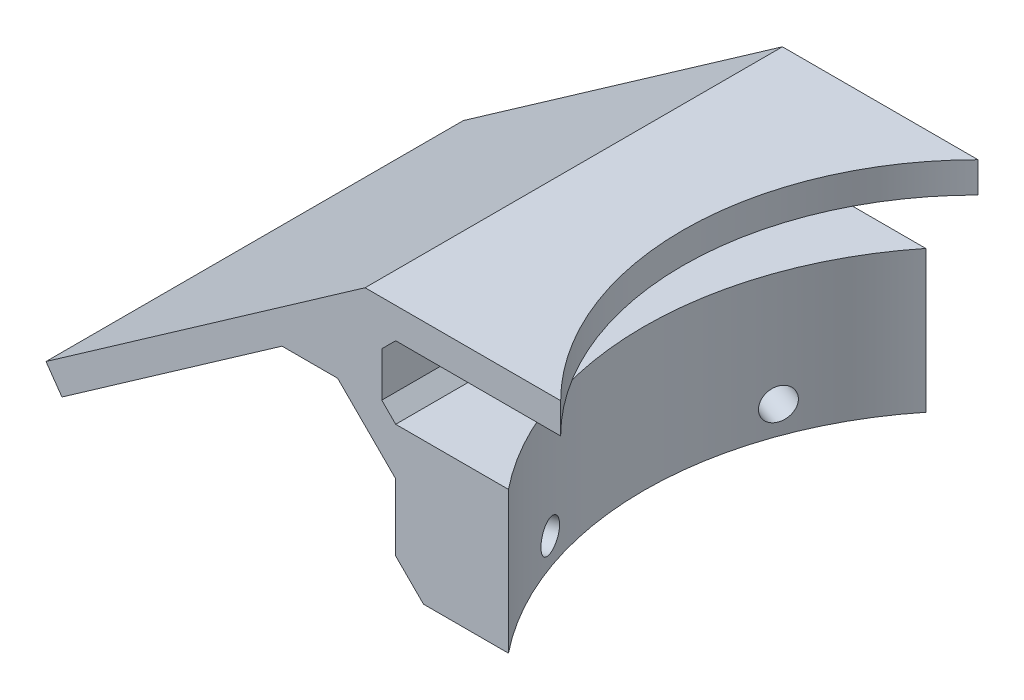
ISO-10303-21;
HEADER;
FILE_DESCRIPTION(('STEP AP214'),'2;1');
FILE_NAME('part.step','',(''),(''),'','','');
FILE_SCHEMA(('AUTOMOTIVE_DESIGN { 1 0 10303 214 1 1 1 1 }'));
ENDSEC;
DATA;
#1=APPLICATION_CONTEXT('core data for automotive mechanical design processes');
#2=APPLICATION_PROTOCOL_DEFINITION('international standard','automotive_design',2000,#1);
#3=PRODUCT_CONTEXT('',#1,'mechanical');
#4=PRODUCT('Part','Part','',(#3));
#5=PRODUCT_RELATED_PRODUCT_CATEGORY('part','',(#4));
#6=PRODUCT_DEFINITION_FORMATION('','',#4);
#7=PRODUCT_DEFINITION_CONTEXT('part definition',#1,'design');
#8=PRODUCT_DEFINITION('design','',#6,#7);
#9=PRODUCT_DEFINITION_SHAPE('','',#8);
#10=(LENGTH_UNIT() NAMED_UNIT(*) SI_UNIT(.MILLI.,.METRE.));
#11=(NAMED_UNIT(*) PLANE_ANGLE_UNIT() SI_UNIT($,.RADIAN.));
#12=(NAMED_UNIT(*) SI_UNIT($,.STERADIAN.) SOLID_ANGLE_UNIT());
#13=UNCERTAINTY_MEASURE_WITH_UNIT(LENGTH_MEASURE(1.E-05),#10,'distance_accuracy_value','');
#14=(GEOMETRIC_REPRESENTATION_CONTEXT(3) GLOBAL_UNCERTAINTY_ASSIGNED_CONTEXT((#13)) GLOBAL_UNIT_ASSIGNED_CONTEXT((#10,
#11,#12)) REPRESENTATION_CONTEXT('',''));
#15=CARTESIAN_POINT('',(0.,0.,0.));
#16=DIRECTION('',(0.,0.,1.));
#17=DIRECTION('',(1.,0.,0.));
#18=AXIS2_PLACEMENT_3D('',#15,#16,#17);
#19=CARTESIAN_POINT('',(0.,25.5,75.));
#20=DIRECTION('',(0.,-1.,0.));
#21=DIRECTION('',(0.,0.,-1.));
#22=AXIS2_PLACEMENT_3D('',#19,#20,#21);
#23=PLANE('',#22);
#24=DIRECTION('',(-1.,0.,0.));
#25=VECTOR('',#24,1.);
#26=CARTESIAN_POINT('',(20.5,25.5,75.));
#27=LINE('',#26,#25);
#28=CARTESIAN_POINT('',(14.262515012012,25.5,75.));
#29=VERTEX_POINT('',#28);
#30=CARTESIAN_POINT('',(-5.99999999999999,25.5,75.));
#31=VERTEX_POINT('',#30);
#32=EDGE_CURVE('E196',#29,#31,#27,.T.);
#33=ORIENTED_EDGE('',*,*,#32,.F.);
#34=CARTESIAN_POINT('',(61.1,25.5,37.5));
#35=DIRECTION('',(0.,-1.,0.));
#36=DIRECTION('',(0.,0.,-1.));
#37=AXIS2_PLACEMENT_3D('',#34,#35,#36);
#38=CIRCLE('',#37,60.);
#39=CARTESIAN_POINT('',(14.262515012012,25.5,0.));
#40=VERTEX_POINT('',#39);
#41=EDGE_CURVE('E197',#29,#40,#38,.T.);
#42=ORIENTED_EDGE('',*,*,#41,.T.);
#43=DIRECTION('',(-1.,0.,0.));
#44=VECTOR('',#43,1.);
#45=CARTESIAN_POINT('',(0.,25.5,0.));
#46=LINE('',#45,#44);
#47=CARTESIAN_POINT('',(-5.99999999999999,25.5,0.));
#48=VERTEX_POINT('',#47);
#49=EDGE_CURVE('E238',#40,#48,#46,.T.);
#50=ORIENTED_EDGE('',*,*,#49,.T.);
#51=DIRECTION('',(0.,0.,-1.));
#52=VECTOR('',#51,1.);
#53=CARTESIAN_POINT('',(-5.99999999999999,25.5,75.));
#54=LINE('',#53,#52);
#55=EDGE_CURVE('E200',#31,#48,#54,.T.);
#56=ORIENTED_EDGE('',*,*,#55,.F.);
#57=EDGE_LOOP('',(#33,#42,#50,#56));
#58=FACE_BOUND('',#57,.T.);
#59=ADVANCED_FACE('F37',(#58),#23,.F.);
#60=CARTESIAN_POINT('',(-5.99999999999999,25.5,75.));
#61=DIRECTION('',(-0.707106781186543,-0.707106781186552,0.));
#62=DIRECTION('',(0.707106781186552,-0.707106781186543,0.));
#63=AXIS2_PLACEMENT_3D('',#60,#61,#62);
#64=PLANE('',#63);
#65=DIRECTION('',(-0.707106781186552,0.707106781186544,0.));
#66=VECTOR('',#65,1.);
#67=CARTESIAN_POINT('',(-5.99999999999999,25.5,0.));
#68=LINE('',#67,#66);
#69=CARTESIAN_POINT('',(-8.50000000000005,28.,0.));
#70=VERTEX_POINT('',#69);
#71=EDGE_CURVE('E240',#48,#70,#68,.T.);
#72=ORIENTED_EDGE('',*,*,#71,.T.);
#73=DIRECTION('',(0.,0.,-1.));
#74=VECTOR('',#73,1.);
#75=CARTESIAN_POINT('',(-8.50000000000005,28.,75.));
#76=LINE('',#75,#74);
#77=CARTESIAN_POINT('',(-8.50000000000005,28.,75.));
#78=VERTEX_POINT('',#77);
#79=EDGE_CURVE('E297',#78,#70,#76,.T.);
#80=ORIENTED_EDGE('',*,*,#79,.F.);
#81=DIRECTION('',(-0.707106781186552,0.707106781186544,0.));
#82=VECTOR('',#81,1.);
#83=CARTESIAN_POINT('',(-5.99999999999999,25.5,75.));
#84=LINE('',#83,#82);
#85=EDGE_CURVE('E204',#31,#78,#84,.T.);
#86=ORIENTED_EDGE('',*,*,#85,.F.);
#87=ORIENTED_EDGE('',*,*,#55,.T.);
#88=EDGE_LOOP('',(#72,#80,#86,#87));
#89=FACE_BOUND('',#88,.T.);
#90=ADVANCED_FACE('F186',(#89),#64,.F.);
#91=CARTESIAN_POINT('',(-8.50000000000005,28.,75.));
#92=DIRECTION('',(-1.,0.,0.));
#93=DIRECTION('',(0.,0.,1.));
#94=AXIS2_PLACEMENT_3D('',#91,#92,#93);
#95=PLANE('',#94);
#96=DIRECTION('',(0.,1.,0.));
#97=VECTOR('',#96,1.);
#98=CARTESIAN_POINT('',(-8.50000000000005,28.,0.));
#99=LINE('',#98,#97);
#100=CARTESIAN_POINT('',(-8.50000000000005,36.,0.));
#101=VERTEX_POINT('',#100);
#102=EDGE_CURVE('E243',#70,#101,#99,.T.);
#103=ORIENTED_EDGE('',*,*,#102,.T.);
#104=DIRECTION('',(0.,0.,-1.));
#105=VECTOR('',#104,1.);
#106=CARTESIAN_POINT('',(-8.50000000000005,36.,75.));
#107=LINE('',#106,#105);
#108=CARTESIAN_POINT('',(-8.50000000000005,36.,75.));
#109=VERTEX_POINT('',#108);
#110=EDGE_CURVE('E294',#109,#101,#107,.T.);
#111=ORIENTED_EDGE('',*,*,#110,.F.);
#112=DIRECTION('',(0.,1.,0.));
#113=VECTOR('',#112,1.);
#114=CARTESIAN_POINT('',(-8.50000000000005,28.,75.));
#115=LINE('',#114,#113);
#116=EDGE_CURVE('E207',#78,#109,#115,.T.);
#117=ORIENTED_EDGE('',*,*,#116,.F.);
#118=ORIENTED_EDGE('',*,*,#79,.T.);
#119=EDGE_LOOP('',(#103,#111,#117,#118));
#120=FACE_BOUND('',#119,.T.);
#121=ADVANCED_FACE('F191',(#120),#95,.F.);
#122=CARTESIAN_POINT('',(-8.50000000000005,36.,75.));
#123=DIRECTION('',(-0.707106781186545,0.70710678118655,0.));
#124=DIRECTION('',(-0.70710678118655,-0.707106781186545,0.));
#125=AXIS2_PLACEMENT_3D('',#122,#123,#124);
#126=PLANE('',#125);
#127=DIRECTION('',(0.70710678118655,0.707106781186545,0.));
#128=VECTOR('',#127,1.);
#129=CARTESIAN_POINT('',(-8.50000000000005,36.,0.));
#130=LINE('',#129,#128);
#131=CARTESIAN_POINT('',(-6.,38.5,0.));
#132=VERTEX_POINT('',#131);
#133=EDGE_CURVE('E245',#101,#132,#130,.T.);
#134=ORIENTED_EDGE('',*,*,#133,.T.);
#135=DIRECTION('',(0.,0.,-1.));
#136=VECTOR('',#135,1.);
#137=CARTESIAN_POINT('',(-6.,38.5,75.));
#138=LINE('',#137,#136);
#139=CARTESIAN_POINT('',(-6.,38.5,75.));
#140=VERTEX_POINT('',#139);
#141=EDGE_CURVE('E291',#140,#132,#138,.T.);
#142=ORIENTED_EDGE('',*,*,#141,.F.);
#143=DIRECTION('',(0.70710678118655,0.707106781186545,0.));
#144=VECTOR('',#143,1.);
#145=CARTESIAN_POINT('',(-8.50000000000005,36.,75.));
#146=LINE('',#145,#144);
#147=EDGE_CURVE('E215',#109,#140,#146,.T.);
#148=ORIENTED_EDGE('',*,*,#147,.F.);
#149=ORIENTED_EDGE('',*,*,#110,.T.);
#150=EDGE_LOOP('',(#134,#142,#148,#149));
#151=FACE_BOUND('',#150,.T.);
#152=ADVANCED_FACE('F313',(#151),#126,.F.);
#153=CARTESIAN_POINT('',(-6.,38.5,75.));
#154=DIRECTION('',(0.,1.,0.));
#155=DIRECTION('',(0.,0.,1.));
#156=AXIS2_PLACEMENT_3D('',#153,#154,#155);
#157=PLANE('',#156);
#158=DIRECTION('',(1.,0.,0.));
#159=VECTOR('',#158,1.);
#160=CARTESIAN_POINT('',(-6.,38.5,0.));
#161=LINE('',#160,#159);
#162=CARTESIAN_POINT('',(23.646695739895,38.5,0.));
#163=VERTEX_POINT('',#162);
#164=EDGE_CURVE('E247',#132,#163,#161,.T.);
#165=ORIENTED_EDGE('',*,*,#164,.T.);
#166=CARTESIAN_POINT('',(61.1,38.5,37.5));
#167=DIRECTION('',(0.,1.,0.));
#168=DIRECTION('',(0.,0.,1.));
#169=AXIS2_PLACEMENT_3D('',#166,#167,#168);
#170=CIRCLE('',#169,53.);
#171=CARTESIAN_POINT('',(23.646695739895,38.5,75.));
#172=VERTEX_POINT('',#171);
#173=EDGE_CURVE('E58',#163,#172,#170,.T.);
#174=ORIENTED_EDGE('',*,*,#173,.T.);
#175=DIRECTION('',(1.,0.,0.));
#176=VECTOR('',#175,1.);
#177=CARTESIAN_POINT('',(-6.,38.5,75.));
#178=LINE('',#177,#176);
#179=EDGE_CURVE('E217',#140,#172,#178,.T.);
#180=ORIENTED_EDGE('',*,*,#179,.F.);
#181=ORIENTED_EDGE('',*,*,#141,.T.);
#182=EDGE_LOOP('',(#165,#174,#180,#181));
#183=FACE_BOUND('',#182,.T.);
#184=ADVANCED_FACE('F308',(#183),#157,.F.);
#185=CARTESIAN_POINT('',(38.5,44.,75.));
#186=DIRECTION('',(0.,-1.,0.));
#187=DIRECTION('',(1.,0.,0.));
#188=AXIS2_PLACEMENT_3D('',#185,#186,#187);
#189=PLANE('',#188);
#190=DIRECTION('',(-1.,0.,0.));
#191=VECTOR('',#190,1.);
#192=CARTESIAN_POINT('',(38.5,44.,75.));
#193=LINE('',#192,#191);
#194=CARTESIAN_POINT('',(23.646695739895,44.,75.));
#195=VERTEX_POINT('',#194);
#196=CARTESIAN_POINT('',(-11.5,44.,75.));
#197=VERTEX_POINT('',#196);
#198=EDGE_CURVE('E220',#195,#197,#193,.T.);
#199=ORIENTED_EDGE('',*,*,#198,.F.);
#200=CARTESIAN_POINT('',(61.1,44.,37.5));
#201=DIRECTION('',(0.,1.,0.));
#202=DIRECTION('',(-1.,0.,0.));
#203=AXIS2_PLACEMENT_3D('',#200,#201,#202);
#204=CIRCLE('',#203,53.);
#205=CARTESIAN_POINT('',(23.646695739895,44.,0.));
#206=VERTEX_POINT('',#205);
#207=EDGE_CURVE('E326',#206,#195,#204,.T.);
#208=ORIENTED_EDGE('',*,*,#207,.F.);
#209=DIRECTION('',(-1.,0.,0.));
#210=VECTOR('',#209,1.);
#211=CARTESIAN_POINT('',(38.5,44.,0.));
#212=LINE('',#211,#210);
#213=CARTESIAN_POINT('',(-11.5,44.,0.));
#214=VERTEX_POINT('',#213);
#215=EDGE_CURVE('E250',#206,#214,#212,.T.);
#216=ORIENTED_EDGE('',*,*,#215,.T.);
#217=DIRECTION('',(0.,0.,-1.));
#218=VECTOR('',#217,1.);
#219=CARTESIAN_POINT('',(-11.5,44.,75.));
#220=LINE('',#219,#218);
#221=EDGE_CURVE('E288',#197,#214,#220,.T.);
#222=ORIENTED_EDGE('',*,*,#221,.F.);
#223=EDGE_LOOP('',(#199,#208,#216,#222));
#224=FACE_BOUND('',#223,.T.);
#225=ADVANCED_FACE('F325',(#224),#189,.F.);
#226=CARTESIAN_POINT('',(-11.5,44.,75.));
#227=DIRECTION('',(0.573576436351047,-0.819152044288991,0.));
#228=DIRECTION('',(0.819152044288991,0.573576436351047,0.));
#229=AXIS2_PLACEMENT_3D('',#226,#227,#228);
#230=PLANE('',#229);
#231=DIRECTION('',(-0.819152044288991,-0.573576436351047,0.));
#232=VECTOR('',#231,1.);
#233=CARTESIAN_POINT('',(-11.5,44.,0.));
#234=LINE('',#233,#232);
#235=CARTESIAN_POINT('',(-68.8406431002294,3.84964945542668,0.));
#236=VERTEX_POINT('',#235);
#237=EDGE_CURVE('E252',#214,#236,#234,.T.);
#238=ORIENTED_EDGE('',*,*,#237,.T.);
#239=DIRECTION('',(0.,0.,-1.));
#240=VECTOR('',#239,1.);
#241=CARTESIAN_POINT('',(-68.8406431002294,3.84964945542668,75.));
#242=LINE('',#241,#240);
#243=CARTESIAN_POINT('',(-68.8406431002294,3.84964945542668,75.));
#244=VERTEX_POINT('',#243);
#245=EDGE_CURVE('E285',#244,#236,#242,.T.);
#246=ORIENTED_EDGE('',*,*,#245,.F.);
#247=DIRECTION('',(-0.819152044288991,-0.573576436351047,0.));
#248=VECTOR('',#247,1.);
#249=CARTESIAN_POINT('',(-11.5,44.,75.));
#250=LINE('',#249,#248);
#251=EDGE_CURVE('E222',#197,#244,#250,.T.);
#252=ORIENTED_EDGE('',*,*,#251,.F.);
#253=ORIENTED_EDGE('',*,*,#221,.T.);
#254=EDGE_LOOP('',(#238,#246,#252,#253));
#255=FACE_BOUND('',#254,.T.);
#256=ADVANCED_FACE('F330',(#255),#230,.F.);
#257=CARTESIAN_POINT('',(-68.8406431002294,3.84964945542668,75.));
#258=DIRECTION('',(0.819152044288993,0.573576436351045,0.));
#259=DIRECTION('',(-0.573576436351045,0.819152044288993,0.));
#260=AXIS2_PLACEMENT_3D('',#257,#258,#259);
#261=PLANE('',#260);
#262=DIRECTION('',(0.573576436351045,-0.819152044288993,0.));
#263=VECTOR('',#262,1.);
#264=CARTESIAN_POINT('',(-68.8406431002294,3.84964945542668,0.));
#265=LINE('',#264,#263);
#266=CARTESIAN_POINT('',(-65.9727609184742,-0.246110766018283,0.));
#267=VERTEX_POINT('',#266);
#268=EDGE_CURVE('E254',#236,#267,#265,.T.);
#269=ORIENTED_EDGE('',*,*,#268,.T.);
#270=DIRECTION('',(0.,0.,-1.));
#271=VECTOR('',#270,1.);
#272=CARTESIAN_POINT('',(-65.9727609184742,-0.246110766018283,75.));
#273=LINE('',#272,#271);
#274=CARTESIAN_POINT('',(-65.9727609184742,-0.246110766018283,75.));
#275=VERTEX_POINT('',#274);
#276=EDGE_CURVE('E282',#275,#267,#273,.T.);
#277=ORIENTED_EDGE('',*,*,#276,.F.);
#278=DIRECTION('',(0.573576436351045,-0.819152044288993,0.));
#279=VECTOR('',#278,1.);
#280=CARTESIAN_POINT('',(-68.8406431002294,3.84964945542668,75.));
#281=LINE('',#280,#279);
#282=EDGE_CURVE('E224',#244,#275,#281,.T.);
#283=ORIENTED_EDGE('',*,*,#282,.F.);
#284=ORIENTED_EDGE('',*,*,#245,.T.);
#285=EDGE_LOOP('',(#269,#277,#283,#284));
#286=FACE_BOUND('',#285,.T.);
#287=ADVANCED_FACE('F336',(#286),#261,.F.);
#288=CARTESIAN_POINT('',(-65.9727609184742,-0.246110766018283,75.));
#289=DIRECTION('',(-0.573576436351048,0.819152044288991,0.));
#290=DIRECTION('',(-0.819152044288991,-0.573576436351048,0.));
#291=AXIS2_PLACEMENT_3D('',#288,#289,#290);
#292=PLANE('',#291);
#293=DIRECTION('',(0.819152044288991,0.573576436351048,0.));
#294=VECTOR('',#293,1.);
#295=CARTESIAN_POINT('',(-65.9727609184742,-0.246110766018283,0.));
#296=LINE('',#295,#294);
#297=CARTESIAN_POINT('',(-26.4284177725488,27.4431363983102,0.));
#298=VERTEX_POINT('',#297);
#299=EDGE_CURVE('E256',#267,#298,#296,.T.);
#300=ORIENTED_EDGE('',*,*,#299,.T.);
#301=DIRECTION('',(0.,0.,-1.));
#302=VECTOR('',#301,1.);
#303=CARTESIAN_POINT('',(-26.4284177725488,27.4431363983102,75.));
#304=LINE('',#303,#302);
#305=CARTESIAN_POINT('',(-26.4284177725488,27.4431363983102,75.));
#306=VERTEX_POINT('',#305);
#307=EDGE_CURVE('E279',#306,#298,#304,.T.);
#308=ORIENTED_EDGE('',*,*,#307,.F.);
#309=DIRECTION('',(0.819152044288991,0.573576436351048,0.));
#310=VECTOR('',#309,1.);
#311=CARTESIAN_POINT('',(-65.9727609184742,-0.246110766018283,75.));
#312=LINE('',#311,#310);
#313=EDGE_CURVE('E226',#275,#306,#312,.T.);
#314=ORIENTED_EDGE('',*,*,#313,.F.);
#315=ORIENTED_EDGE('',*,*,#276,.T.);
#316=EDGE_LOOP('',(#300,#308,#314,#315));
#317=FACE_BOUND('',#316,.T.);
#318=ADVANCED_FACE('F340',(#317),#292,.F.);
#319=CARTESIAN_POINT('',(-16.4284177725488,27.4431363983102,75.));
#320=DIRECTION('',(0.,1.,0.));
#321=DIRECTION('',(0.,0.,1.));
#322=AXIS2_PLACEMENT_3D('',#319,#320,#321);
#323=PLANE('',#322);
#324=DIRECTION('',(1.,0.,0.));
#325=VECTOR('',#324,1.);
#326=CARTESIAN_POINT('',(-16.4284177725488,27.4431363983102,0.));
#327=LINE('',#326,#325);
#328=CARTESIAN_POINT('',(-16.4284177725488,27.4431363983102,0.));
#329=VERTEX_POINT('',#328);
#330=EDGE_CURVE('E258',#298,#329,#327,.T.);
#331=ORIENTED_EDGE('',*,*,#330,.T.);
#332=DIRECTION('',(0.,0.,-1.));
#333=VECTOR('',#332,1.);
#334=CARTESIAN_POINT('',(-16.4284177725488,27.4431363983102,75.));
#335=LINE('',#334,#333);
#336=CARTESIAN_POINT('',(-16.4284177725488,27.4431363983102,75.));
#337=VERTEX_POINT('',#336);
#338=EDGE_CURVE('E276',#337,#329,#335,.T.);
#339=ORIENTED_EDGE('',*,*,#338,.F.);
#340=DIRECTION('',(1.,0.,0.));
#341=VECTOR('',#340,1.);
#342=CARTESIAN_POINT('',(-16.4284177725488,27.4431363983102,75.));
#343=LINE('',#342,#341);
#344=EDGE_CURVE('E228',#306,#337,#343,.T.);
#345=ORIENTED_EDGE('',*,*,#344,.F.);
#346=ORIENTED_EDGE('',*,*,#307,.T.);
#347=EDGE_LOOP('',(#331,#339,#345,#346));
#348=FACE_BOUND('',#347,.T.);
#349=ADVANCED_FACE('F345',(#348),#323,.F.);
#350=CARTESIAN_POINT('',(-16.4284177725488,27.4431363983102,75.));
#351=DIRECTION('',(0.707106781186543,0.707106781186552,0.));
#352=DIRECTION('',(-0.707106781186552,0.707106781186543,0.));
#353=AXIS2_PLACEMENT_3D('',#350,#351,#352);
#354=PLANE('',#353);
#355=DIRECTION('',(0.707106781186552,-0.707106781186543,0.));
#356=VECTOR('',#355,1.);
#357=CARTESIAN_POINT('',(-16.4284177725488,27.4431363983102,0.));
#358=LINE('',#357,#356);
#359=CARTESIAN_POINT('',(-5.99999999999999,17.0147186257615,0.));
#360=VERTEX_POINT('',#359);
#361=EDGE_CURVE('E260',#329,#360,#358,.T.);
#362=ORIENTED_EDGE('',*,*,#361,.T.);
#363=DIRECTION('',(0.,0.,-1.));
#364=VECTOR('',#363,1.);
#365=CARTESIAN_POINT('',(-5.99999999999999,17.0147186257615,75.));
#366=LINE('',#365,#364);
#367=CARTESIAN_POINT('',(-5.99999999999999,17.0147186257615,75.));
#368=VERTEX_POINT('',#367);
#369=EDGE_CURVE('E273',#368,#360,#366,.T.);
#370=ORIENTED_EDGE('',*,*,#369,.F.);
#371=DIRECTION('',(0.707106781186552,-0.707106781186543,0.));
#372=VECTOR('',#371,1.);
#373=CARTESIAN_POINT('',(-16.4284177725488,27.4431363983102,75.));
#374=LINE('',#373,#372);
#375=EDGE_CURVE('E230',#337,#368,#374,.T.);
#376=ORIENTED_EDGE('',*,*,#375,.F.);
#377=ORIENTED_EDGE('',*,*,#338,.T.);
#378=EDGE_LOOP('',(#362,#370,#376,#377));
#379=FACE_BOUND('',#378,.T.);
#380=ADVANCED_FACE('F351',(#379),#354,.F.);
#381=CARTESIAN_POINT('',(-5.99999999999999,17.0147186257615,75.));
#382=DIRECTION('',(1.,0.,0.));
#383=DIRECTION('',(0.,1.,0.));
#384=AXIS2_PLACEMENT_3D('',#381,#382,#383);
#385=PLANE('',#384);
#386=DIRECTION('',(0.,-1.,0.));
#387=VECTOR('',#386,1.);
#388=CARTESIAN_POINT('',(-5.99999999999999,17.0147186257615,0.));
#389=LINE('',#388,#387);
#390=CARTESIAN_POINT('',(-5.99999999999999,4.99999999999994,0.));
#391=VERTEX_POINT('',#390);
#392=EDGE_CURVE('E262',#360,#391,#389,.T.);
#393=ORIENTED_EDGE('',*,*,#392,.T.);
#394=DIRECTION('',(0.,0.,-1.));
#395=VECTOR('',#394,1.);
#396=CARTESIAN_POINT('',(-5.99999999999999,4.99999999999994,75.));
#397=LINE('',#396,#395);
#398=CARTESIAN_POINT('',(-5.99999999999999,4.99999999999994,75.));
#399=VERTEX_POINT('',#398);
#400=EDGE_CURVE('E270',#399,#391,#397,.T.);
#401=ORIENTED_EDGE('',*,*,#400,.F.);
#402=DIRECTION('',(0.,-1.,0.));
#403=VECTOR('',#402,1.);
#404=CARTESIAN_POINT('',(-5.99999999999999,17.0147186257615,75.));
#405=LINE('',#404,#403);
#406=EDGE_CURVE('E232',#368,#399,#405,.T.);
#407=ORIENTED_EDGE('',*,*,#406,.F.);
#408=ORIENTED_EDGE('',*,*,#369,.T.);
#409=EDGE_LOOP('',(#393,#401,#407,#408));
#410=FACE_BOUND('',#409,.T.);
#411=ADVANCED_FACE('F355',(#410),#385,.F.);
#412=CARTESIAN_POINT('',(-5.99999999999999,4.99999999999994,75.));
#413=DIRECTION('',(0.707106781186543,0.707106781186552,0.));
#414=DIRECTION('',(-0.707106781186552,0.707106781186543,0.));
#415=AXIS2_PLACEMENT_3D('',#412,#413,#414);
#416=PLANE('',#415);
#417=DIRECTION('',(0.707106781186552,-0.707106781186543,0.));
#418=VECTOR('',#417,1.);
#419=CARTESIAN_POINT('',(-5.99999999999999,4.99999999999994,0.));
#420=LINE('',#419,#418);
#421=CARTESIAN_POINT('',(-0.999999999999992,0.,0.));
#422=VERTEX_POINT('',#421);
#423=EDGE_CURVE('E264',#391,#422,#420,.T.);
#424=ORIENTED_EDGE('',*,*,#423,.T.);
#425=DIRECTION('',(0.,0.,-1.));
#426=VECTOR('',#425,1.);
#427=CARTESIAN_POINT('',(-0.999999999999992,0.,75.));
#428=LINE('',#427,#426);
#429=CARTESIAN_POINT('',(-0.999999999999992,0.,75.));
#430=VERTEX_POINT('',#429);
#431=EDGE_CURVE('E237',#430,#422,#428,.T.);
#432=ORIENTED_EDGE('',*,*,#431,.F.);
#433=DIRECTION('',(0.707106781186552,-0.707106781186543,0.));
#434=VECTOR('',#433,1.);
#435=CARTESIAN_POINT('',(-5.99999999999999,4.99999999999994,75.));
#436=LINE('',#435,#434);
#437=EDGE_CURVE('E234',#399,#430,#436,.T.);
#438=ORIENTED_EDGE('',*,*,#437,.F.);
#439=ORIENTED_EDGE('',*,*,#400,.T.);
#440=EDGE_LOOP('',(#424,#432,#438,#439));
#441=FACE_BOUND('',#440,.T.);
#442=ADVANCED_FACE('F360',(#441),#416,.F.);
#443=CARTESIAN_POINT('',(-0.999999999999992,0.,75.));
#444=DIRECTION('',(0.,1.,0.));
#445=DIRECTION('',(0.,0.,1.));
#446=AXIS2_PLACEMENT_3D('',#443,#444,#445);
#447=PLANE('',#446);
#448=DIRECTION('',(1.,0.,0.));
#449=VECTOR('',#448,1.);
#450=CARTESIAN_POINT('',(-0.999999999999992,0.,0.));
#451=LINE('',#450,#449);
#452=CARTESIAN_POINT('',(14.262515012012,0.,0.));
#453=VERTEX_POINT('',#452);
#454=EDGE_CURVE('E210',#422,#453,#451,.T.);
#455=ORIENTED_EDGE('',*,*,#454,.T.);
#456=CARTESIAN_POINT('',(61.1,0.,37.5));
#457=DIRECTION('',(0.,-1.,0.));
#458=DIRECTION('',(0.,0.,-1.));
#459=AXIS2_PLACEMENT_3D('',#456,#457,#458);
#460=CIRCLE('',#459,60.);
#461=CARTESIAN_POINT('',(14.262515012012,0.,75.));
#462=VERTEX_POINT('',#461);
#463=EDGE_CURVE('E51',#462,#453,#460,.T.);
#464=ORIENTED_EDGE('',*,*,#463,.F.);
#465=DIRECTION('',(1.,0.,0.));
#466=VECTOR('',#465,1.);
#467=CARTESIAN_POINT('',(0.,0.,75.));
#468=LINE('',#467,#466);
#469=EDGE_CURVE('E205',#430,#462,#468,.T.);
#470=ORIENTED_EDGE('',*,*,#469,.F.);
#471=ORIENTED_EDGE('',*,*,#431,.T.);
#472=EDGE_LOOP('',(#455,#464,#470,#471));
#473=FACE_BOUND('',#472,.T.);
#474=ADVANCED_FACE('F363',(#473),#447,.F.);
#475=CARTESIAN_POINT('',(0.,0.,75.));
#476=DIRECTION('',(0.,0.,1.));
#477=DIRECTION('',(1.,0.,0.));
#478=AXIS2_PLACEMENT_3D('',#475,#476,#477);
#479=PLANE('',#478);
#480=DIRECTION('',(0.,-1.,0.));
#481=VECTOR('',#480,1.);
#482=CARTESIAN_POINT('',(14.262515012012,28.,75.));
#483=LINE('',#482,#481);
#484=EDGE_CURVE('E361',#29,#462,#483,.T.);
#485=ORIENTED_EDGE('',*,*,#484,.F.);
#486=ORIENTED_EDGE('',*,*,#32,.T.);
#487=ORIENTED_EDGE('',*,*,#85,.T.);
#488=ORIENTED_EDGE('',*,*,#116,.T.);
#489=ORIENTED_EDGE('',*,*,#147,.T.);
#490=ORIENTED_EDGE('',*,*,#179,.T.);
#491=DIRECTION('',(0.,1.,0.));
#492=VECTOR('',#491,1.);
#493=CARTESIAN_POINT('',(23.646695739895,-31.,75.));
#494=LINE('',#493,#492);
#495=EDGE_CURVE('E241',#195,#172,#494,.F.);
#496=ORIENTED_EDGE('',*,*,#495,.F.);
#497=ORIENTED_EDGE('',*,*,#198,.T.);
#498=ORIENTED_EDGE('',*,*,#251,.T.);
#499=ORIENTED_EDGE('',*,*,#282,.T.);
#500=ORIENTED_EDGE('',*,*,#313,.T.);
#501=ORIENTED_EDGE('',*,*,#344,.T.);
#502=ORIENTED_EDGE('',*,*,#375,.T.);
#503=ORIENTED_EDGE('',*,*,#406,.T.);
#504=ORIENTED_EDGE('',*,*,#437,.T.);
#505=ORIENTED_EDGE('',*,*,#469,.T.);
#506=EDGE_LOOP('',(#485,#486,#487,#488,#489,#490,#496,#497,#498,#499,#500,#501,#502,#503,#504,#505));
#507=FACE_BOUND('',#506,.T.);
#508=ADVANCED_FACE('F320',(#507),#479,.T.);
#509=CARTESIAN_POINT('',(0.,0.,0.));
#510=DIRECTION('',(0.,0.,1.));
#511=DIRECTION('',(1.,0.,0.));
#512=AXIS2_PLACEMENT_3D('',#509,#510,#511);
#513=PLANE('',#512);
#514=ORIENTED_EDGE('',*,*,#49,.F.);
#515=DIRECTION('',(0.,-1.,0.));
#516=VECTOR('',#515,1.);
#517=CARTESIAN_POINT('',(14.262515012012,28.,0.));
#518=LINE('',#517,#516);
#519=EDGE_CURVE('E11',#40,#453,#518,.T.);
#520=ORIENTED_EDGE('',*,*,#519,.T.);
#521=ORIENTED_EDGE('',*,*,#454,.F.);
#522=ORIENTED_EDGE('',*,*,#423,.F.);
#523=ORIENTED_EDGE('',*,*,#392,.F.);
#524=ORIENTED_EDGE('',*,*,#361,.F.);
#525=ORIENTED_EDGE('',*,*,#330,.F.);
#526=ORIENTED_EDGE('',*,*,#299,.F.);
#527=ORIENTED_EDGE('',*,*,#268,.F.);
#528=ORIENTED_EDGE('',*,*,#237,.F.);
#529=ORIENTED_EDGE('',*,*,#215,.F.);
#530=DIRECTION('',(0.,1.,0.));
#531=VECTOR('',#530,1.);
#532=CARTESIAN_POINT('',(23.646695739895,-31.,0.));
#533=LINE('',#532,#531);
#534=EDGE_CURVE('E44',#206,#163,#533,.F.);
#535=ORIENTED_EDGE('',*,*,#534,.T.);
#536=ORIENTED_EDGE('',*,*,#164,.F.);
#537=ORIENTED_EDGE('',*,*,#133,.F.);
#538=ORIENTED_EDGE('',*,*,#102,.F.);
#539=ORIENTED_EDGE('',*,*,#71,.F.);
#540=EDGE_LOOP('',(#514,#520,#521,#522,#523,#524,#525,#526,#527,#528,#529,#535,#536,#537,#538,#539));
#541=FACE_BOUND('',#540,.T.);
#542=ADVANCED_FACE('F303',(#541),#513,.F.);
#543=CARTESIAN_POINT('',(61.1,-31.,37.5));
#544=DIRECTION('',(0.,1.,0.));
#545=DIRECTION('',(-1.,0.,0.));
#546=AXIS2_PLACEMENT_3D('',#543,#544,#545);
#547=CYLINDRICAL_SURFACE('',#546,53.);
#548=ORIENTED_EDGE('',*,*,#495,.T.);
#549=ORIENTED_EDGE('',*,*,#173,.F.);
#550=ORIENTED_EDGE('',*,*,#534,.F.);
#551=ORIENTED_EDGE('',*,*,#207,.T.);
#552=EDGE_LOOP('',(#548,#549,#550,#551));
#553=FACE_BOUND('',#552,.T.);
#554=ADVANCED_FACE('F377',(#553),#547,.F.);
#555=CARTESIAN_POINT('',(61.1,28.,37.5));
#556=DIRECTION('',(0.,-1.,0.));
#557=DIRECTION('',(0.,0.,-1.));
#558=AXIS2_PLACEMENT_3D('',#555,#556,#557);
#559=CYLINDRICAL_SURFACE('',#558,60.);
#560=CARTESIAN_POINT('',(4.7184427528454,2.20000000000002,16.9787914004602));
#561=CARTESIAN_POINT('',(4.66468299120149,2.20000694162317,17.1264976909588));
#562=CARTESIAN_POINT('',(4.61146999789182,2.21328048162023,17.2745219575986));
#563=CARTESIAN_POINT('',(4.50763681836295,2.26604354502469,17.5668974283624));
#564=CARTESIAN_POINT('',(4.45701977177687,2.3055640428623,17.7112440832453));
#565=CARTESIAN_POINT('',(4.35973902754718,2.40968787388119,17.9919288841332));
#566=CARTESIAN_POINT('',(4.31307334589903,2.47427852711363,18.1282710385742));
#567=CARTESIAN_POINT('',(4.22478583774634,2.62668994907286,18.3890348635504));
#568=CARTESIAN_POINT('',(4.18316281584038,2.71450519645711,18.5134593577887));
#569=CARTESIAN_POINT('',(4.10581947240217,2.91096139852563,18.7469057218281));
#570=CARTESIAN_POINT('',(4.07010380123909,3.01961861642521,18.8559154471559));
#571=CARTESIAN_POINT('',(4.00533019112133,3.25464232218397,19.0552259346491));
#572=CARTESIAN_POINT('',(3.97627252273377,3.38100952940335,19.1455259364767));
#573=CARTESIAN_POINT('',(3.92534563851702,3.64793228854563,19.3047831062998));
#574=CARTESIAN_POINT('',(3.90347958737326,3.78849405134465,19.3737308774266));
#575=CARTESIAN_POINT('',(3.86733541109882,4.07977211445844,19.4881781393085));
#576=CARTESIAN_POINT('',(3.85305723386847,4.23048834504286,19.5336777910626));
#577=CARTESIAN_POINT('',(3.83233378017333,4.5376796104744,19.5998430288626));
#578=CARTESIAN_POINT('',(3.82588275115995,4.69415032882185,19.6205268531316));
#579=CARTESIAN_POINT('',(3.82089863982456,5.0085069661852,19.6365003220473));
#580=CARTESIAN_POINT('',(3.82236550124117,5.16639287513736,19.6317901471338));
#581=CARTESIAN_POINT('',(3.83318924922626,5.47896829283613,19.5971312768939));
#582=CARTESIAN_POINT('',(3.84253997106579,5.6336602023116,19.5672023012416));
#583=CARTESIAN_POINT('',(3.86897134103715,5.93558798437866,19.4830277690884));
#584=CARTESIAN_POINT('',(3.88605201869138,6.0828238284915,19.4287821197169));
#585=CARTESIAN_POINT('',(3.92766378440605,6.36572650543492,19.2975636997699));
#586=CARTESIAN_POINT('',(3.9521978085228,6.50138875211832,19.2205819732281));
#587=CARTESIAN_POINT('',(4.00827728257182,6.75724310484313,19.0461776495417));
#588=CARTESIAN_POINT('',(4.03982277525314,6.87743511655516,18.9487549277682));
#589=CARTESIAN_POINT('',(4.10935701238437,7.09905732853572,18.7362292094267));
#590=CARTESIAN_POINT('',(4.14735188078332,7.20046950340006,18.6211094186546));
#591=CARTESIAN_POINT('',(4.22897881444734,7.38151445060959,18.3766234646241));
#592=CARTESIAN_POINT('',(4.27261088098754,7.46114721802827,18.2472572981432));
#593=CARTESIAN_POINT('',(4.36453424187844,7.59637108813659,17.9780345513909));
#594=CARTESIAN_POINT('',(4.41282565568729,7.65196157422045,17.8381777021757));
#595=CARTESIAN_POINT('',(4.51289009488026,7.73751114642038,17.5520188675896));
#596=CARTESIAN_POINT('',(4.56466309754009,7.7674703998136,17.4057169242879));
#597=CARTESIAN_POINT('',(4.67027831795507,7.80088488332008,17.1110082695359));
#598=CARTESIAN_POINT('',(4.7241185410289,7.80436504801392,16.9626036700941));
#599=CARTESIAN_POINT('',(4.83239705595716,7.78478761762838,16.6677767818839));
#600=CARTESIAN_POINT('',(4.88683534609242,7.76173009881351,16.5213544874201));
#601=CARTESIAN_POINT('',(4.99465493712317,7.68975245661329,16.2346829262763));
#602=CARTESIAN_POINT('',(5.04803669210291,7.64084370565016,16.0944309745176));
#603=CARTESIAN_POINT('',(5.1520825135771,7.51856346730524,15.8239406664716));
#604=CARTESIAN_POINT('',(5.20274656646274,7.4451918574398,15.6937023603259));
#605=CARTESIAN_POINT('',(5.29971839622482,7.27600473446036,15.44674147869));
#606=CARTESIAN_POINT('',(5.34602288995895,7.18017249299826,15.3300290743926));
#607=CARTESIAN_POINT('',(5.43263870029655,6.96880889615514,15.1134299131155));
#608=CARTESIAN_POINT('',(5.47294998312982,6.85327742978196,15.0135432509441));
#609=CARTESIAN_POINT('',(5.54617229044103,6.60568770875471,14.8332461430387));
#610=CARTESIAN_POINT('',(5.57907758633805,6.4736167827726,14.7528507702638));
#611=CARTESIAN_POINT('',(5.63624133186917,6.19676127315757,14.6138218778824));
#612=CARTESIAN_POINT('',(5.66049981550443,6.05197673952014,14.5551882727038));
#613=CARTESIAN_POINT('',(5.69945279446868,5.75386384331495,14.4612940871474));
#614=CARTESIAN_POINT('',(5.71415119687549,5.60053899890696,14.4260239583194));
#615=CARTESIAN_POINT('',(5.7334407232183,5.28964848109537,14.3797761401601));
#616=CARTESIAN_POINT('',(5.73803189474209,5.13208282766226,14.3687983364536));
#617=CARTESIAN_POINT('',(5.73693170920065,4.81734397901955,14.3714317214746));
#618=CARTESIAN_POINT('',(5.73125015112129,4.6601705528648,14.3850194775224));
#619=CARTESIAN_POINT('',(5.70984088161719,4.35052750025659,14.4363698416104));
#620=CARTESIAN_POINT('',(5.69411315086494,4.19805788285323,14.4741324961601));
#621=CARTESIAN_POINT('',(5.65320762094398,3.90214471267989,14.5728098478864));
#622=CARTESIAN_POINT('',(5.62802972881851,3.75870124871211,14.633724772801));
#623=CARTESIAN_POINT('',(5.56916417969758,3.48490551767091,14.7770545729758));
#624=CARTESIAN_POINT('',(5.5354767931659,3.35455283470719,14.8594687649112));
#625=CARTESIAN_POINT('',(5.46078922340389,3.11051300987148,15.0436405650817));
#626=CARTESIAN_POINT('',(5.41978288452929,2.99684004435205,15.145414460676));
#627=CARTESIAN_POINT('',(5.33191999759324,2.78948265664424,15.3655186856466));
#628=CARTESIAN_POINT('',(5.28506201095173,2.69580316508387,15.4838530871547));
#629=CARTESIAN_POINT('',(5.18707518172006,2.53105381838749,15.7339053930228));
#630=CARTESIAN_POINT('',(5.13594255382027,2.4600042762439,15.8656351821755));
#631=CARTESIAN_POINT('',(5.031169412692,2.34271728891587,16.1386441110984));
#632=CARTESIAN_POINT('',(4.97753194961437,2.29645048019434,16.2799117255102));
#633=CARTESIAN_POINT('',(4.88938623470619,2.2422034757798,16.5148530998817));
#634=CARTESIAN_POINT('',(4.85511251048372,2.22639731873637,16.6068818982239));
#635=CARTESIAN_POINT('',(4.78663393414815,2.20529339051042,16.7921619040413));
#636=CARTESIAN_POINT('',(4.7524290819843,2.19999561158233,16.8854131106154));
#637=CARTESIAN_POINT('',(4.7184427528454,2.20000000000002,16.9787914004602));
#638=B_SPLINE_CURVE_WITH_KNOTS('',3,(#560,#561,#562,#563,#564,#565,#566,#567,#568,#569,#570,
#571,#572,#573,#574,#575,#576,#577,#578,#579,#580,#581,#582,#583,#584,#585,#586,#587,#588,#589,
#590,#591,#592,#593,#594,#595,#596,#597,#598,#599,#600,#601,#602,#603,#604,#605,#606,#607,#608,
#609,#610,#611,#612,#613,#614,#615,#616,#617,#618,#619,#620,#621,#622,#623,#624,#625,#626,#627,
#628,#629,#630,#631,#632,#633,#634,#635,#636,#637),.UNSPECIFIED.,.T.,.F.,(4,2,2,2,2,2,2,2,2,2,2,
2,2,2,2,2,2,2,2,2,2,2,2,2,2,2,2,2,2,2,2,2,2,2,2,2,2,2,4),(0.,0.471193561893207,
0.942944176835041,1.4144565006642,1.88585682923261,2.35762650408202,2.82941534725147,
3.30141152511969,3.7734044621378,4.24505029825816,4.71669278305577,5.18796681201264,
5.65924264088412,6.13070435813903,6.60216894998351,7.07408374722129,7.54599865120604,
8.01792565754489,8.48984958392205,8.96132905832428,9.432807177783,9.904078057949,
10.3753512977673,10.8469766566507,11.31860467292,11.7905962523925,12.26258597587,
12.7343826820293,13.2061771668278,13.6775218521167,14.1488674442139,14.6202176728358,
15.0915529220573,15.5632864745536,16.0351362280611,16.5074083353287,16.9791196316784,
17.2770032308006,17.5748866103571),.UNSPECIFIED.);
#639=CARTESIAN_POINT('',(4.7184427528454,2.20000000000002,16.9787914004602));
#640=VERTEX_POINT('',#639);
#641=EDGE_CURVE('E161',#640,#640,#638,.T.);
#642=ORIENTED_EDGE('',*,*,#641,.T.);
#643=EDGE_LOOP('',(#642));
#644=FACE_BOUND('',#643,.T.);
#645=CARTESIAN_POINT('',(4.71844275284541,2.20000000000001,58.0212085995398));
#646=CARTESIAN_POINT('',(4.77220415957997,2.20000694162317,58.1689142912744));
#647=CARTESIAN_POINT('',(4.82658880628235,2.21328048162023,58.3165121109543));
#648=CARTESIAN_POINT('',(4.93498330607613,2.26604354502469,58.6072273969128));
#649=CARTESIAN_POINT('',(4.98899264007015,2.3055640428623,58.750339360153));
#650=CARTESIAN_POINT('',(5.09489197876862,2.40968787388118,59.0278872491932));
#651=CARTESIAN_POINT('',(5.14678304021034,2.47427852711363,59.1623275209265));
#652=CARTESIAN_POINT('',(5.2467666409423,2.62668994907286,59.4188343163466));
#653=CARTESIAN_POINT('',(5.29486007954329,2.71450519645711,59.5409037715046));
#654=CARTESIAN_POINT('',(5.38566807142114,2.91096139852563,59.7694494042972));
#655=CARTESIAN_POINT('',(5.42837838077041,3.01961861642521,59.8759132895257));
#656=CARTESIAN_POINT('',(5.50687322852014,3.25464232218397,60.0702296549436));
#657=CARTESIAN_POINT('',(5.54265748545135,3.38100952940336,60.1580813787632));
#658=CARTESIAN_POINT('',(5.60601376430779,3.64793228854564,60.3128146189075));
#659=CARTESIAN_POINT('',(5.63358217033192,3.78849405134465,60.3796869025926));
#660=CARTESIAN_POINT('',(5.67945940684606,4.07977211445845,60.490591620259));
#661=CARTESIAN_POINT('',(5.69776830091346,4.23048834504287,60.5346242110616));
#662=CARTESIAN_POINT('',(5.72442340941787,4.53767961047441,60.5986305030711));
#663=CARTESIAN_POINT('',(5.73277694045078,4.69415032882185,60.6186218732343));
#664=CARTESIAN_POINT('',(5.73922643756119,5.0085069661852,60.6340619853462));
#665=CARTESIAN_POINT('',(5.73732247652434,5.16639287513737,60.6295109016839));
#666=CARTESIAN_POINT('',(5.72333565616611,5.47896829283613,60.5960032956367));
#667=CARTESIAN_POINT('',(5.7112607499505,5.63366020231161,60.5670658420099));
#668=CARTESIAN_POINT('',(5.67740200772187,5.93558798437867,60.4855946522772));
#669=CARTESIAN_POINT('',(5.65561813462815,6.08282382849151,60.4330608260515));
#670=CARTESIAN_POINT('',(5.60314902201766,6.36572650543492,60.3057941571977));
#671=CARTESIAN_POINT('',(5.5724602748663,6.50138875211833,60.2310525666406));
#672=CARTESIAN_POINT('',(5.50331470599324,6.75724310484313,60.0614039125483));
#673=CARTESIAN_POINT('',(5.46485783690928,6.87743511655516,59.9664967260632));
#674=CARTESIAN_POINT('',(5.38151525438051,7.09905732853572,59.7589968344308));
#675=CARTESIAN_POINT('',(5.33662343704654,7.20046950340006,59.6463873277783));
#676=CARTESIAN_POINT('',(5.24200075399553,7.38151445060959,59.4066314396967));
#677=CARTESIAN_POINT('',(5.1922698871839,7.46114721802827,59.2794850549794));
#678=CARTESIAN_POINT('',(5.08963422112902,7.59637108813659,59.0141612684471));
#679=CARTESIAN_POINT('',(5.03672934052233,7.65196157422045,58.8759835838231));
#680=CARTESIAN_POINT('',(4.92944379484565,7.73751114642038,58.5924530170556));
#681=CARTESIAN_POINT('',(4.8750631394094,7.7674703998136,58.4471001817458));
#682=CARTESIAN_POINT('',(4.76653402037512,7.80088488332008,58.1534520993569));
#683=CARTESIAN_POINT('',(4.71238538633541,7.80436504801391,58.0051597523265));
#684=CARTESIAN_POINT('',(4.60582047026146,7.78478761762837,57.7097091651399));
#685=CARTESIAN_POINT('',(4.55340418324921,7.76173009881351,57.5625509217257));
#686=CARTESIAN_POINT('',(4.45172985426497,7.68975245661328,57.2736426681153));
#687=CARTESIAN_POINT('',(4.40247043420626,7.64084370565015,57.1318903091496));
#688=CARTESIAN_POINT('',(4.30830633902406,7.51856346730523,56.8578033468701));
#689=CARTESIAN_POINT('',(4.26340168570602,7.44519185743979,56.7254687907146));
#690=CARTESIAN_POINT('',(4.17894302224152,7.27600473446035,56.47395348901));
#691=CARTESIAN_POINT('',(4.13939303497887,7.18017249299824,56.3547826454098));
#692=CARTESIAN_POINT('',(4.06651733803682,6.96880889615512,56.1331824918412));
#693=CARTESIAN_POINT('',(4.03319166342952,6.85327742978195,56.0307532762073));
#694=CARTESIAN_POINT('',(3.97339045803372,6.60568770875469,55.8455712866937));
#695=CARTESIAN_POINT('',(3.94692022760901,6.47361678277258,55.7628337416314));
#696=CARTESIAN_POINT('',(3.90134414780978,6.19676127315755,55.6195872838389));
#697=CARTESIAN_POINT('',(3.88223826947698,6.05197673952013,55.5590782837013));
#698=CARTESIAN_POINT('',(3.85172396345825,5.75386384331493,55.462112672376));
#699=CARTESIAN_POINT('',(3.840312391142,5.60053899890694,55.4256462352299));
#700=CARTESIAN_POINT('',(3.82536150111951,5.28964848109535,55.3778192825928));
#701=CARTESIAN_POINT('',(3.82182214634857,5.13208282766224,55.3664586488963));
#702=CARTESIAN_POINT('',(3.82267206259122,4.81734397901953,55.3691831244927));
#703=CARTESIAN_POINT('',(3.82705377782719,4.66017055286478,55.3832439846446));
#704=CARTESIAN_POINT('',(3.84366070368103,4.35052750025657,55.4363422588761));
#705=CARTESIAN_POINT('',(3.8558859293888,4.19805788285321,55.4753797210073));
#706=CARTESIAN_POINT('',(3.88797905454635,3.90214471267987,55.5772645257598));
#707=CARTESIAN_POINT('',(3.90784702917428,3.75870124871209,55.6401121025899));
#708=CARTESIAN_POINT('',(3.95488402203029,3.4849055176709,55.7877471451595));
#709=CARTESIAN_POINT('',(3.98205280821285,3.35455283470717,55.872533913591));
#710=CARTESIAN_POINT('',(4.04322216162986,3.11051300987146,56.0616259421315));
#711=CARTESIAN_POINT('',(4.07722848267989,2.99684004435203,56.1659476358533));
#712=CARTESIAN_POINT('',(4.15140187503688,2.78948265664422,56.3910344293728));
#713=CARTESIAN_POINT('',(4.19157046184349,2.69580316508386,56.5118035733059));
#714=CARTESIAN_POINT('',(4.27723871979731,2.53105381838748,56.7663394724479));
#715=CARTESIAN_POINT('',(4.32274313062655,2.46000427624389,56.9001177650862));
#716=CARTESIAN_POINT('',(4.41796900492257,2.34271728891586,57.1766016149547));
#717=CARTESIAN_POINT('',(4.46768539658283,2.29645048019433,57.3192963826488));
#718=CARTESIAN_POINT('',(4.55117926594136,2.24220347577979,57.5559308903348));
#719=CARTESIAN_POINT('',(4.58407904126446,2.22639731873636,57.6484597651797));
#720=CARTESIAN_POINT('',(4.65071710045197,2.20529339051041,57.8344096644547));
#721=CARTESIAN_POINT('',(4.68445538369831,2.19999561158232,57.927830688227));
#722=CARTESIAN_POINT('',(4.71844275284541,2.20000000000001,58.0212085995398));
#723=B_SPLINE_CURVE_WITH_KNOTS('',3,(#645,#646,#647,#648,#649,#650,#651,#652,#653,#654,#655,
#656,#657,#658,#659,#660,#661,#662,#663,#664,#665,#666,#667,#668,#669,#670,#671,#672,#673,#674,
#675,#676,#677,#678,#679,#680,#681,#682,#683,#684,#685,#686,#687,#688,#689,#690,#691,#692,#693,
#694,#695,#696,#697,#698,#699,#700,#701,#702,#703,#704,#705,#706,#707,#708,#709,#710,#711,#712,
#713,#714,#715,#716,#717,#718,#719,#720,#721,#722),.UNSPECIFIED.,.T.,.F.,(4,2,2,2,2,2,2,2,2,2,2,
2,2,2,2,2,2,2,2,2,2,2,2,2,2,2,2,2,2,2,2,2,2,2,2,2,2,2,4),(0.,0.471193561893205,
0.942944176835039,1.41445650066419,1.8858568292326,2.35762650408202,2.82941534725147,
3.30141152511969,3.7734044621378,4.24505029825816,4.71669278305577,5.18796681201264,
5.65924264088412,6.13070435813902,6.6021689499835,7.07408374722127,7.54599865120604,
8.01792565754489,8.48984958392204,8.96132905832427,9.432807177783,9.90407805794899,
10.3753512977673,10.8469766566507,11.31860467292,11.7905962523925,12.26258597587,
12.7343826820293,13.2061771668278,13.6775218521167,14.1488674442139,14.6202176728358,
15.0915529220573,15.5632864745536,16.0351362280611,16.5074083353288,16.9791196316784,
17.2770032308006,17.5748866103571),.UNSPECIFIED.);
#724=CARTESIAN_POINT('',(4.71844275284541,2.20000000000001,58.0212085995398));
#725=VERTEX_POINT('',#724);
#726=EDGE_CURVE('E365',#725,#725,#723,.T.);
#727=ORIENTED_EDGE('',*,*,#726,.T.);
#728=EDGE_LOOP('',(#727));
#729=FACE_BOUND('',#728,.T.);
#730=ORIENTED_EDGE('',*,*,#484,.T.);
#731=ORIENTED_EDGE('',*,*,#463,.T.);
#732=ORIENTED_EDGE('',*,*,#519,.F.);
#733=ORIENTED_EDGE('',*,*,#41,.F.);
#734=EDGE_LOOP('',(#730,#731,#732,#733));
#735=FACE_BOUND('',#734,.T.);
#736=ADVANCED_FACE('F379',(#644,#729,#735),#559,.F.);
#737=CARTESIAN_POINT('',(4.71844275284539,5.,58.0212085995398));
#738=DIRECTION('',(0.93969262078591,0.,-0.342020143325664));
#739=DIRECTION('',(-0.342020143325664,0.,-0.93969262078591));
#740=AXIS2_PLACEMENT_3D('',#737,#738,#739);
#741=CYLINDRICAL_SURFACE('',#740,2.79999999999999);
#742=ORIENTED_EDGE('',*,*,#726,.F.);
#743=EDGE_LOOP('',(#742));
#744=FACE_BOUND('',#743,.T.);
#745=CARTESIAN_POINT('',(-2.89306747552048,5.,60.7915717604777));
#746=DIRECTION('',(0.93969262078591,0.,-0.342020143325664));
#747=DIRECTION('',(-0.342020143325664,0.,-0.93969262078591));
#748=AXIS2_PLACEMENT_3D('',#745,#746,#747);
#749=CIRCLE('',#748,2.79999999999999);
#750=CARTESIAN_POINT('',(-3.85072387683233,5.,58.1604324222771));
#751=VERTEX_POINT('',#750);
#752=EDGE_CURVE('E164',#751,#751,#749,.T.);
#753=ORIENTED_EDGE('',*,*,#752,.F.);
#754=EDGE_LOOP('',(#753));
#755=FACE_BOUND('',#754,.T.);
#756=ADVANCED_FACE('F182',(#744,#755),#741,.F.);
#757=CARTESIAN_POINT('',(-2.89306747552048,5.,60.7915717604777));
#758=DIRECTION('',(0.93969262078591,0.,-0.342020143325664));
#759=DIRECTION('',(-0.342020143325664,0.,-0.93969262078591));
#760=AXIS2_PLACEMENT_3D('',#757,#758,#759);
#761=CONICAL_SURFACE('',#760,2.79999999999999,1.02974425867665);
#762=CARTESIAN_POINT('',(-4.47401548701941,5.,61.3669897785856));
#763=VERTEX_POINT('',#762);
#764=VERTEX_LOOP('',#763);
#765=FACE_BOUND('',#764,.T.);
#766=ORIENTED_EDGE('',*,*,#752,.T.);
#767=EDGE_LOOP('',(#766));
#768=FACE_BOUND('',#767,.T.);
#769=ADVANCED_FACE('F177',(#765,#768),#761,.F.);
#770=CARTESIAN_POINT('',(4.7184427528454,5.00000000000001,16.9787914004602));
#771=DIRECTION('',(0.939692620785911,0.,0.342020143325663));
#772=DIRECTION('',(0.342020143325663,0.,-0.939692620785911));
#773=AXIS2_PLACEMENT_3D('',#770,#771,#772);
#774=CYLINDRICAL_SURFACE('',#773,2.79999999999999);
#775=ORIENTED_EDGE('',*,*,#641,.F.);
#776=EDGE_LOOP('',(#775));
#777=FACE_BOUND('',#776,.T.);
#778=CARTESIAN_POINT('',(-2.89306747552047,5.00000000000001,14.2084282395223));
#779=DIRECTION('',(0.939692620785911,0.,0.342020143325663));
#780=DIRECTION('',(0.342020143325663,0.,-0.939692620785911));
#781=AXIS2_PLACEMENT_3D('',#778,#779,#780);
#782=CIRCLE('',#781,2.79999999999999);
#783=CARTESIAN_POINT('',(-1.93541107420862,5.00000000000001,11.5772889013218));
#784=VERTEX_POINT('',#783);
#785=EDGE_CURVE('E159',#784,#784,#782,.T.);
#786=ORIENTED_EDGE('',*,*,#785,.F.);
#787=EDGE_LOOP('',(#786));
#788=FACE_BOUND('',#787,.T.);
#789=ADVANCED_FACE('F155',(#777,#788),#774,.F.);
#790=CARTESIAN_POINT('',(-2.89306747552047,5.00000000000001,14.2084282395223));
#791=DIRECTION('',(0.939692620785911,0.,0.342020143325663));
#792=DIRECTION('',(0.342020143325663,0.,-0.939692620785911));
#793=AXIS2_PLACEMENT_3D('',#790,#791,#792);
#794=CONICAL_SURFACE('',#793,2.79999999999999,1.02974425867666);
#795=CARTESIAN_POINT('',(-4.47401548701941,5.00000000000001,13.6330102214144));
#796=VERTEX_POINT('',#795);
#797=VERTEX_LOOP('',#796);
#798=FACE_BOUND('',#797,.T.);
#799=ORIENTED_EDGE('',*,*,#785,.T.);
#800=EDGE_LOOP('',(#799));
#801=FACE_BOUND('',#800,.T.);
#802=ADVANCED_FACE('F152',(#798,#801),#794,.F.);
#803=CLOSED_SHELL('',(#59,#90,#121,#152,#184,#225,#256,#287,#318,#349,#380,#411,#442,#474,#508,
#542,#554,#736,#756,#769,#789,#802));
#804=MANIFOLD_SOLID_BREP('B2',#803);
#805=ADVANCED_BREP_SHAPE_REPRESENTATION('',(#18,#804),#14);
#806=SHAPE_DEFINITION_REPRESENTATION(#9,#805);
ENDSEC;
END-ISO-10303-21;
